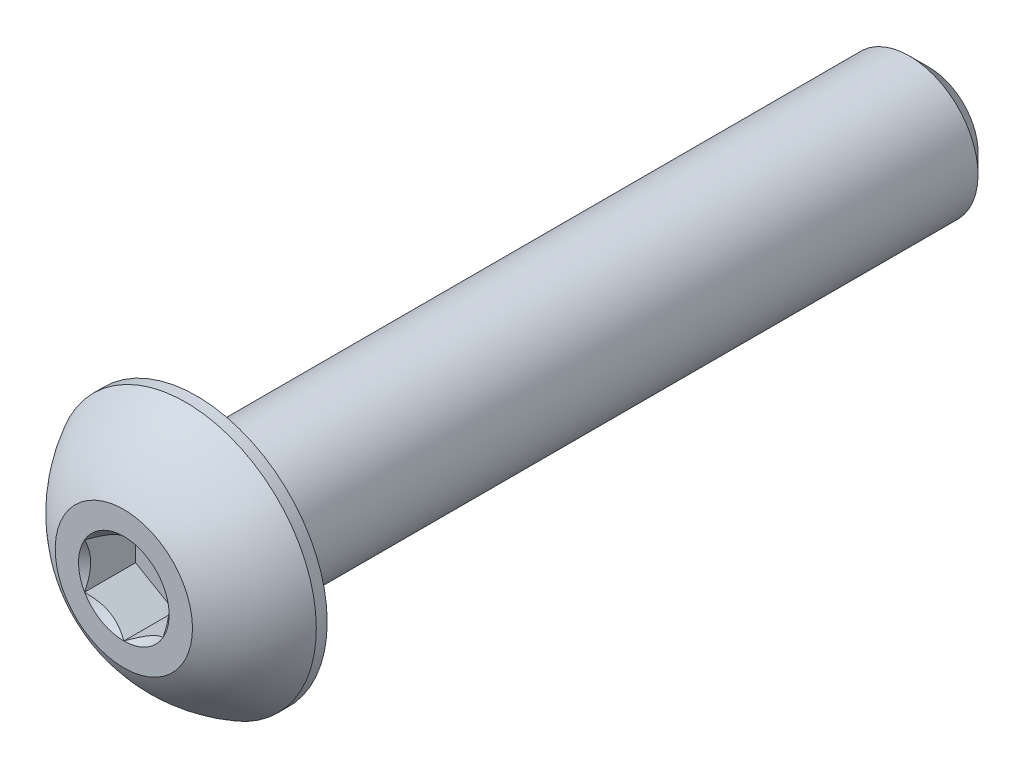
ISO-10303-21;
HEADER;
FILE_DESCRIPTION(('STEP AP214'),'2;1');
FILE_NAME('part.step','',(''),(''),'','','');
FILE_SCHEMA(('AUTOMOTIVE_DESIGN { 1 0 10303 214 1 1 1 1 }'));
ENDSEC;
DATA;
#1=APPLICATION_CONTEXT('core data for automotive mechanical design processes');
#2=APPLICATION_PROTOCOL_DEFINITION('international standard','automotive_design',2000,#1);
#3=PRODUCT_CONTEXT('',#1,'mechanical');
#4=PRODUCT('Part','Part','',(#3));
#5=PRODUCT_RELATED_PRODUCT_CATEGORY('part','',(#4));
#6=PRODUCT_DEFINITION_FORMATION('','',#4);
#7=PRODUCT_DEFINITION_CONTEXT('part definition',#1,'design');
#8=PRODUCT_DEFINITION('design','',#6,#7);
#9=PRODUCT_DEFINITION_SHAPE('','',#8);
#10=(LENGTH_UNIT() NAMED_UNIT(*) SI_UNIT(.MILLI.,.METRE.));
#11=(NAMED_UNIT(*) PLANE_ANGLE_UNIT() SI_UNIT($,.RADIAN.));
#12=(NAMED_UNIT(*) SI_UNIT($,.STERADIAN.) SOLID_ANGLE_UNIT());
#13=UNCERTAINTY_MEASURE_WITH_UNIT(LENGTH_MEASURE(1.E-05),#10,'distance_accuracy_value','');
#14=(GEOMETRIC_REPRESENTATION_CONTEXT(3) GLOBAL_UNCERTAINTY_ASSIGNED_CONTEXT((#13)) GLOBAL_UNIT_ASSIGNED_CONTEXT((#10,
#11,#12)) REPRESENTATION_CONTEXT('',''));
#15=CARTESIAN_POINT('',(0.,0.,0.));
#16=DIRECTION('',(0.,0.,1.));
#17=DIRECTION('',(1.,0.,0.));
#18=AXIS2_PLACEMENT_3D('',#15,#16,#17);
#19=CARTESIAN_POINT('',(0.,-2.0828,-24.4348));
#20=DIRECTION('',(0.,0.,-1.));
#21=DIRECTION('',(0.,1.,0.));
#22=AXIS2_PLACEMENT_3D('',#19,#20,#21);
#23=PLANE('',#22);
#24=CARTESIAN_POINT('',(0.,0.,-24.4348));
#25=DIRECTION('',(0.,0.,-1.));
#26=DIRECTION('',(0.,1.,0.));
#27=AXIS2_PLACEMENT_3D('',#24,#25,#26);
#28=CIRCLE('',#27,1.48748750000001);
#29=CARTESIAN_POINT('',(0.,1.48748750000001,-24.4348));
#30=VERTEX_POINT('',#29);
#31=EDGE_CURVE('E193',#30,#30,#28,.T.);
#32=ORIENTED_EDGE('',*,*,#31,.T.);
#33=EDGE_LOOP('',(#32));
#34=FACE_BOUND('',#33,.T.);
#35=ADVANCED_FACE('F36',(#34),#23,.T.);
#36=CARTESIAN_POINT('',(0.,0.,-24.4348));
#37=DIRECTION('',(0.,0.,-1.));
#38=DIRECTION('',(0.,1.,0.));
#39=AXIS2_PLACEMENT_3D('',#36,#37,#38);
#40=CYLINDRICAL_SURFACE('',#39,2.0828);
#41=CARTESIAN_POINT('',(0.,0.,-23.8394875));
#42=DIRECTION('',(0.,0.,-1.));
#43=DIRECTION('',(0.,1.,0.));
#44=AXIS2_PLACEMENT_3D('',#41,#42,#43);
#45=CIRCLE('',#44,2.0828);
#46=CARTESIAN_POINT('',(0.,2.0828,-23.8394875));
#47=VERTEX_POINT('',#46);
#48=EDGE_CURVE('E50',#47,#47,#45,.F.);
#49=ORIENTED_EDGE('',*,*,#48,.T.);
#50=EDGE_LOOP('',(#49));
#51=FACE_BOUND('',#50,.T.);
#52=CARTESIAN_POINT('',(0.,0.,-2.2098));
#53=DIRECTION('',(0.,0.,1.));
#54=DIRECTION('',(1.,0.,0.));
#55=AXIS2_PLACEMENT_3D('',#52,#53,#54);
#56=CIRCLE('',#55,2.0828);
#57=CARTESIAN_POINT('',(2.0828,0.,-2.2098));
#58=VERTEX_POINT('',#57);
#59=EDGE_CURVE('E189',#58,#58,#56,.F.);
#60=ORIENTED_EDGE('',*,*,#59,.T.);
#61=EDGE_LOOP('',(#60));
#62=FACE_BOUND('',#61,.T.);
#63=ADVANCED_FACE('F202',(#51,#62),#40,.T.);
#64=CARTESIAN_POINT('',(0.,0.,-24.4348));
#65=DIRECTION('',(0.,0.,1.));
#66=DIRECTION('',(0.,-1.,0.));
#67=AXIS2_PLACEMENT_3D('',#64,#65,#66);
#68=CONICAL_SURFACE('',#67,1.48748750000001,0.785398163397445);
#69=ORIENTED_EDGE('',*,*,#48,.F.);
#70=EDGE_LOOP('',(#69));
#71=FACE_BOUND('',#70,.T.);
#72=ORIENTED_EDGE('',*,*,#31,.F.);
#73=EDGE_LOOP('',(#72));
#74=FACE_BOUND('',#73,.T.);
#75=ADVANCED_FACE('F38',(#71,#74),#68,.T.);
#76=CARTESIAN_POINT('',(0.,0.,-3.96380867816092));
#77=DIRECTION('',(0.,0.,1.));
#78=DIRECTION('',(0.,-1.,0.));
#79=AXIS2_PLACEMENT_3D('',#76,#77,#78);
#80=SPHERICAL_SURFACE('',#79,4.47770421947049);
#81=CARTESIAN_POINT('',(0.,0.,0.));
#82=DIRECTION('',(0.,0.,1.));
#83=DIRECTION('',(1.,0.,0.));
#84=AXIS2_PLACEMENT_3D('',#81,#82,#83);
#85=CIRCLE('',#84,2.0828);
#86=CARTESIAN_POINT('',(0.,-2.0828,0.));
#87=VERTEX_POINT('',#86);
#88=EDGE_CURVE('E185',#87,#87,#85,.T.);
#89=CARTESIAN_POINT('',(0.,0.,-1.87833));
#90=DIRECTION('',(0.,0.,1.));
#91=DIRECTION('',(1.,0.,0.));
#92=AXIS2_PLACEMENT_3D('',#89,#90,#91);
#93=CIRCLE('',#92,3.9624);
#94=CARTESIAN_POINT('',(0.,-3.9624,-1.87833));
#95=VERTEX_POINT('',#94);
#96=EDGE_CURVE('E177',#95,#95,#93,.T.);
#97=CARTESIAN_POINT('',(0.,-2.0828,0.));
#98=CARTESIAN_POINT('',(0.,-2.10767763915469,-0.0130720224519119));
#99=CARTESIAN_POINT('',(0.,-2.1324321825138,-0.0263783080421214));
#100=CARTESIAN_POINT('',(0.,-2.18168637330346,-0.0534545587178047));
#101=CARTESIAN_POINT('',(0.,-2.20618602073402,-0.0672245238032784));
#102=CARTESIAN_POINT('',(0.,-2.25492171532923,-0.0952232866881574));
#103=CARTESIAN_POINT('',(0.,-2.27915776249387,-0.109452084487563));
#104=CARTESIAN_POINT('',(0.,-2.32735766987978,-0.138363459316015));
#105=CARTESIAN_POINT('',(0.,-2.35132153010105,-0.153046036345062));
#106=CARTESIAN_POINT('',(0.,-2.39896856692664,-0.18285976708332));
#107=CARTESIAN_POINT('',(0.,-2.42265174353097,-0.197990920792531));
#108=CARTESIAN_POINT('',(0.,-2.46972901769116,-0.22869644015681));
#109=CARTESIAN_POINT('',(0.,-2.49312311524703,-0.244270805811878));
#110=CARTESIAN_POINT('',(0.,-2.53961393789287,-0.275857228060145));
#111=CARTESIAN_POINT('',(0.,-2.56271066298286,-0.291869284653343));
#112=CARTESIAN_POINT('',(0.,-2.60859855282429,-0.324325412379582));
#113=CARTESIAN_POINT('',(0.,-2.63138971757574,-0.340769483512622));
#114=CARTESIAN_POINT('',(0.,-2.67665840715661,-0.37408381082988));
#115=CARTESIAN_POINT('',(0.,-2.69913593198603,-0.390954067014097));
#116=CARTESIAN_POINT('',(0.,-2.74376937333514,-0.425114783844112));
#117=CARTESIAN_POINT('',(0.,-2.76592528985483,-0.442405244489911));
#118=CARTESIAN_POINT('',(0.,-2.80990766020607,-0.477400240693377));
#119=CARTESIAN_POINT('',(0.,-2.83173411403762,-0.495104776251046));
#120=CARTESIAN_POINT('',(0.,-2.8750498214309,-0.530921645935845));
#121=CARTESIAN_POINT('',(0.,-2.89653907499262,-0.549033980062975));
#122=CARTESIAN_POINT('',(0.,-2.9391727638035,-0.585660025978066));
#123=CARTESIAN_POINT('',(0.,-2.96031719905264,-0.604173737766027));
#124=CARTESIAN_POINT('',(0.,-3.00225375543539,-0.641595975803774));
#125=CARTESIAN_POINT('',(0.,-3.02304587656899,-0.66050450205356));
#126=CARTESIAN_POINT('',(0.,-3.06427043381468,-0.698709665852366));
#127=CARTESIAN_POINT('',(0.,-3.08470286992677,-0.718006303401387));
#128=CARTESIAN_POINT('',(0.,-3.12520081373356,-0.756980849048762));
#129=CARTESIAN_POINT('',(0.,-3.14526632142825,-0.776658757147117));
#130=CARTESIAN_POINT('',(0.,-3.1850232950822,-0.816388867981037));
#131=CARTESIAN_POINT('',(0.,-3.20471476104147,-0.836441070716602));
#132=CARTESIAN_POINT('',(0.,-3.24371667050612,-0.876912662223586));
#133=CARTESIAN_POINT('',(0.,-3.2630271140115,-0.897332050995005));
#134=CARTESIAN_POINT('',(0.,-3.30126013292422,-0.938530775803146));
#135=CARTESIAN_POINT('',(0.,-3.32018270833155,-0.959310111839867));
#136=CARTESIAN_POINT('',(0.,-3.35763328290506,-1.00122136480503));
#137=CARTESIAN_POINT('',(0.,-3.37616128207125,-1.02235328173348));
#138=CARTESIAN_POINT('',(0.,-3.41281613589854,-1.06496220511693));
#139=CARTESIAN_POINT('',(0.,-3.43094299055964,-1.08643921157194));
#140=CARTESIAN_POINT('',(0.,-3.46678912932052,-1.12973070030741));
#141=CARTESIAN_POINT('',(0.,-3.48450841342031,-1.15154518258787));
#142=CARTESIAN_POINT('',(0.,-3.51953312948771,-1.19550388963655));
#143=CARTESIAN_POINT('',(0.,-3.53683856145534,-1.21764811440477));
#144=CARTESIAN_POINT('',(0.,-3.57102943840132,-1.26225845619532));
#145=CARTESIAN_POINT('',(0.,-3.58791488337967,-1.28472457321766));
#146=CARTESIAN_POINT('',(0.,-3.62125980037302,-1.32997073517287));
#147=CARTESIAN_POINT('',(0.,-3.637719272388,-1.35275078010575));
#148=CARTESIAN_POINT('',(0.,-3.67020640850626,-1.39861672224058));
#149=CARTESIAN_POINT('',(0.,-3.68623407260953,-1.42170261944253));
#150=CARTESIAN_POINT('',(0.,-3.71785191097313,-1.46817208208141));
#151=CARTESIAN_POINT('',(0.,-3.73344208523347,-1.49155564751835));
#152=CARTESIAN_POINT('',(0.,-3.76417941729919,-1.53861215694335));
#153=CARTESIAN_POINT('',(0.,-3.77932657510458,-1.56228510093141));
#154=CARTESIAN_POINT('',(0.,-3.80917250385283,-1.60991197565512));
#155=CARTESIAN_POINT('',(0.,-3.82387127479568,-1.63386590639077));
#156=CARTESIAN_POINT('',(0.,-3.85281522152763,-1.68204626145442));
#157=CARTESIAN_POINT('',(0.,-3.86706039731673,-1.70627268578243));
#158=CARTESIAN_POINT('',(0.,-3.89509209445425,-1.754989444771));
#159=CARTESIAN_POINT('',(0.,-3.90887861580268,-1.77947977943156));
#160=CARTESIAN_POINT('',(0.,-3.93598815139536,-1.8287156580258));
#161=CARTESIAN_POINT('',(0.,-3.94931116563961,-1.85346120195948));
#162=CARTESIAN_POINT('',(0.,-3.9624,-1.87833));
#163=B_SPLINE_CURVE_WITH_KNOTS('',3,(#97,#98,#99,#100,#101,#102,#103,#104,#105,#106,#107,#108,
#109,#110,#111,#112,#113,#114,#115,#116,#117,#118,#119,#120,#121,#122,#123,#124,#125,#126,#127,
#128,#129,#130,#131,#132,#133,#134,#135,#136,#137,#138,#139,#140,#141,#142,#143,#144,#145,#146,
#147,#148,#149,#150,#151,#152,#153,#154,#155,#156,#157,#158,#159,#160,#161,#162),.UNSPECIFIED.,
.F.,.F.,(4,2,2,2,2,2,2,2,2,2,2,2,2,2,2,2,2,2,2,2,2,2,2,2,2,2,2,2,2,2,2,2,4),(0.,
0.0843075442014962,0.168615088402992,0.252922632604488,0.337230176805985,0.421537721007481,
0.505845265208977,0.590152809410473,0.674460353611968,0.758767897813465,0.843075442014961,
0.927382986216457,1.01169053041795,1.09599807461945,1.18030561882095,1.26461316302244,
1.34892070722394,1.43322825142543,1.51753579562693,1.60184333982843,1.68615088402992,
1.77045842823142,1.85476597243292,1.93907351663441,2.02338106083591,2.1076886050374,
2.1919961492389,2.2763036934404,2.36061123764189,2.44491878184339,2.52922632604488,
2.61353387024638,2.69784141444788),.UNSPECIFIED.);
#164=EDGE_CURVE('BSEAM207',#87,#95,#163,.T.);
#165=ORIENTED_EDGE('',*,*,#88,.F.);
#166=ORIENTED_EDGE('',*,*,#96,.T.);
#167=ORIENTED_EDGE('',*,*,#164,.T.);
#168=ORIENTED_EDGE('',*,*,#164,.F.);
#169=EDGE_LOOP('',(#165,#167,#166,#168));
#170=FACE_BOUND('',#169,.T.);
#171=ADVANCED_FACE('F207',(#170),#80,.T.);
#172=CARTESIAN_POINT('',(0.,-2.0828,0.));
#173=DIRECTION('',(0.,0.,-1.));
#174=DIRECTION('',(-1.,0.,0.));
#175=AXIS2_PLACEMENT_3D('',#172,#173,#174);
#176=PLANE('',#175);
#177=CARTESIAN_POINT('',(0.,0.,0.));
#178=DIRECTION('',(0.,0.,1.));
#179=DIRECTION('',(1.,0.,0.));
#180=AXIS2_PLACEMENT_3D('',#177,#178,#179);
#181=CIRCLE('',#180,1.3748153285078);
#182=CARTESIAN_POINT('',(-1.190625,0.687407664253898,0.));
#183=VERTEX_POINT('',#182);
#184=CARTESIAN_POINT('',(-1.190625,-0.687407664253898,0.));
#185=VERTEX_POINT('',#184);
#186=EDGE_CURVE('E63',#183,#185,#181,.T.);
#187=ORIENTED_EDGE('',*,*,#186,.F.);
#188=CARTESIAN_POINT('',(0.,1.3748153285078,0.));
#189=VERTEX_POINT('',#188);
#190=EDGE_CURVE('E141',#189,#183,#181,.T.);
#191=ORIENTED_EDGE('',*,*,#190,.F.);
#192=CARTESIAN_POINT('',(1.190625,0.687407664253897,0.));
#193=VERTEX_POINT('',#192);
#194=EDGE_CURVE('E135',#193,#189,#181,.T.);
#195=ORIENTED_EDGE('',*,*,#194,.F.);
#196=CARTESIAN_POINT('',(1.190625,-0.687407664253897,0.));
#197=VERTEX_POINT('',#196);
#198=EDGE_CURVE('E104',#197,#193,#181,.T.);
#199=ORIENTED_EDGE('',*,*,#198,.F.);
#200=CARTESIAN_POINT('',(0.,-1.3748153285078,0.));
#201=VERTEX_POINT('',#200);
#202=EDGE_CURVE('E95',#201,#197,#181,.T.);
#203=ORIENTED_EDGE('',*,*,#202,.F.);
#204=EDGE_CURVE('E56',#185,#201,#181,.T.);
#205=ORIENTED_EDGE('',*,*,#204,.F.);
#206=EDGE_LOOP('',(#187,#191,#195,#199,#203,#205));
#207=FACE_BOUND('',#206,.T.);
#208=ORIENTED_EDGE('',*,*,#88,.T.);
#209=EDGE_LOOP('',(#208));
#210=FACE_BOUND('',#209,.T.);
#211=ADVANCED_FACE('F132',(#207,#210),#176,.F.);
#212=CARTESIAN_POINT('',(0.,-3.9624,-2.2098));
#213=DIRECTION('',(0.,0.,1.));
#214=DIRECTION('',(1.,0.,0.));
#215=AXIS2_PLACEMENT_3D('',#212,#213,#214);
#216=PLANE('',#215);
#217=ORIENTED_EDGE('',*,*,#59,.F.);
#218=EDGE_LOOP('',(#217));
#219=FACE_BOUND('',#218,.T.);
#220=CARTESIAN_POINT('',(0.,0.,-2.2098));
#221=DIRECTION('',(0.,0.,1.));
#222=DIRECTION('',(1.,0.,0.));
#223=AXIS2_PLACEMENT_3D('',#220,#221,#222);
#224=CIRCLE('',#223,3.9624);
#225=CARTESIAN_POINT('',(3.9624,0.,-2.2098));
#226=VERTEX_POINT('',#225);
#227=EDGE_CURVE('E181',#226,#226,#224,.T.);
#228=ORIENTED_EDGE('',*,*,#227,.F.);
#229=EDGE_LOOP('',(#228));
#230=FACE_BOUND('',#229,.T.);
#231=ADVANCED_FACE('F221',(#219,#230),#216,.F.);
#232=CARTESIAN_POINT('',(0.,0.,0.));
#233=DIRECTION('',(0.,0.,1.));
#234=DIRECTION('',(1.,0.,0.));
#235=AXIS2_PLACEMENT_3D('',#232,#233,#234);
#236=CYLINDRICAL_SURFACE('',#235,3.9624);
#237=ORIENTED_EDGE('',*,*,#96,.F.);
#238=EDGE_LOOP('',(#237));
#239=FACE_BOUND('',#238,.T.);
#240=ORIENTED_EDGE('',*,*,#227,.T.);
#241=EDGE_LOOP('',(#240));
#242=FACE_BOUND('',#241,.T.);
#243=ADVANCED_FACE('F224',(#239,#242),#236,.T.);
#244=CARTESIAN_POINT('',(0.,0.,0.));
#245=DIRECTION('',(0.,0.,1.));
#246=DIRECTION('',(1.,0.,0.));
#247=AXIS2_PLACEMENT_3D('',#244,#245,#246);
#248=CONICAL_SURFACE('',#247,1.3748153285078,0.78539816339745);
#249=ORIENTED_EDGE('',*,*,#198,.T.);
#250=CARTESIAN_POINT('',(1.190625,-1.3709714531464,0.440990447440542));
#251=CARTESIAN_POINT('',(1.190625,-1.33758920657277,0.415789988952627));
#252=CARTESIAN_POINT('',(1.190625,-1.30402095515484,0.39083662037646));
#253=CARTESIAN_POINT('',(1.190625,-1.23643692315458,0.341526087304664));
#254=CARTESIAN_POINT('',(1.190625,-1.20242103236242,0.317169074021072));
#255=CARTESIAN_POINT('',(1.190625,-1.09909081497949,0.244798209093533));
#256=CARTESIAN_POINT('',(1.190625,-1.02900143520981,0.19787262268834));
#257=CARTESIAN_POINT('',(1.190625,-0.882026737540628,0.105752103394674));
#258=CARTESIAN_POINT('',(1.190625,-0.804981866122373,0.0608088372989927));
#259=CARTESIAN_POINT('',(1.190625,-0.647043893381153,-0.0214019754586495));
#260=CARTESIAN_POINT('',(1.190625,-0.566164943760922,-0.0586953982437512));
#261=CARTESIAN_POINT('',(1.190625,-0.44476493391543,-0.104320444420462));
#262=CARTESIAN_POINT('',(1.190625,-0.406041211538073,-0.117415160961774));
#263=CARTESIAN_POINT('',(1.190625,-0.32765890477302,-0.140495724086987));
#264=CARTESIAN_POINT('',(1.190625,-0.288000256184281,-0.150481356498339));
#265=CARTESIAN_POINT('',(1.190625,-0.208647693287847,-0.166658770921501));
#266=CARTESIAN_POINT('',(1.190625,-0.168967240702489,-0.172915554139536));
#267=CARTESIAN_POINT('',(1.190625,-0.0891819743864537,-0.181513111574599));
#268=CARTESIAN_POINT('',(1.190625,-0.0490772347958497,-0.183854558946056));
#269=CARTESIAN_POINT('',(1.190625,0.0297075772901237,-0.184447755934784));
#270=CARTESIAN_POINT('',(1.190625,0.0683866067218453,-0.182844646209978));
#271=CARTESIAN_POINT('',(1.190625,0.145416876518752,-0.175956972269255));
#272=CARTESIAN_POINT('',(1.190625,0.183768052622756,-0.170671702349432));
#273=CARTESIAN_POINT('',(1.190625,0.260508634780065,-0.156618587793746));
#274=CARTESIAN_POINT('',(1.190625,0.298887051910834,-0.147791637425378));
#275=CARTESIAN_POINT('',(1.190625,0.374805334115854,-0.127124290059814));
#276=CARTESIAN_POINT('',(1.190625,0.412345269069195,-0.115284145209173));
#277=CARTESIAN_POINT('',(1.190625,0.530535580740913,-0.0735526663999539));
#278=CARTESIAN_POINT('',(1.190625,0.609503725551088,-0.0389086031730741));
#279=CARTESIAN_POINT('',(1.190625,0.763730268871195,0.0381182518446595));
#280=CARTESIAN_POINT('',(1.190625,0.838974064408866,0.0805288465159381));
#281=CARTESIAN_POINT('',(1.190625,0.982775795881686,0.16802564482912));
#282=CARTESIAN_POINT('',(1.190625,1.05148016574364,0.212874161838997));
#283=CARTESIAN_POINT('',(1.190625,1.15270222220782,0.282205329675897));
#284=CARTESIAN_POINT('',(1.190625,1.18600604109445,0.305560176080384));
#285=CARTESIAN_POINT('',(1.190625,1.25215860324015,0.352887568742374));
#286=CARTESIAN_POINT('',(1.190625,1.28500746829151,0.376859944571279));
#287=CARTESIAN_POINT('',(1.190625,1.31766689387937,0.401088366474198));
#288=B_SPLINE_CURVE_WITH_KNOTS('',3,(#250,#251,#252,#253,#254,#255,#256,#257,#258,#259,#260,
#261,#262,#263,#264,#265,#266,#267,#268,#269,#270,#271,#272,#273,#274,#275,#276,#277,#278,#279,
#280,#281,#282,#283,#284,#285,#286,#287),.UNSPECIFIED.,.F.,.F.,(4,2,2,2,2,2,2,2,2,2,2,2,2,2,2,2,
2,2,4),(0.,0.125475644787212,0.25098278246174,0.503912518865618,0.77127918479425,
1.03772598276166,1.16025581663754,1.28279408924409,1.40312855519665,1.52344233020123,
1.63939577678758,1.75537145253144,1.87336894106198,1.99135655871206,2.24929724984113,
2.50818004702776,2.75419821455323,2.87622362097735,2.99821570364111),.UNSPECIFIED.);
#289=EDGE_CURVE('E11',#197,#193,#288,.T.);
#290=ORIENTED_EDGE('',*,*,#289,.F.);
#291=EDGE_LOOP('',(#249,#290));
#292=FACE_BOUND('',#291,.T.);
#293=ADVANCED_FACE('F108',(#292),#248,.F.);
#294=ORIENTED_EDGE('',*,*,#194,.T.);
#295=CARTESIAN_POINT('',(1.190825,0.68729219420006,0.000115484600024774));
#296=CARTESIAN_POINT('',(1.14989058041014,0.710925692369385,-0.0235012357857359));
#297=CARTESIAN_POINT('',(1.10827161169803,0.734954415158721,-0.0457312182768786));
#298=CARTESIAN_POINT('',(1.02340555632637,0.783951855072609,-0.0864343373725623));
#299=CARTESIAN_POINT('',(0.980150392709039,0.808925235430915,-0.104884817352448));
#300=CARTESIAN_POINT('',(0.892928352542576,0.859282903800291,-0.136491161995679));
#301=CARTESIAN_POINT('',(0.848983705042075,0.884654357864148,-0.149726495756683));
#302=CARTESIAN_POINT('',(0.760126625836306,0.935956016463003,-0.170118548424605));
#303=CARTESIAN_POINT('',(0.715216911165245,0.961884652317569,-0.177290497104007));
#304=CARTESIAN_POINT('',(0.637820872343021,1.00656927616579,-0.183761461351143));
#305=CARTESIAN_POINT('',(0.605434587484353,1.02526750644699,-0.18471967985321));
#306=CARTESIAN_POINT('',(0.54071892668223,1.06263111063189,-0.183107350927916));
#307=CARTESIAN_POINT('',(0.508389564872727,1.08129647637533,-0.18053602482042));
#308=CARTESIAN_POINT('',(0.444042843928515,1.11844707303394,-0.172013246006378));
#309=CARTESIAN_POINT('',(0.412025803663232,1.13693211984976,-0.166058645247436));
#310=CARTESIAN_POINT('',(0.348526236603542,1.17359361198509,-0.1510900359288));
#311=CARTESIAN_POINT('',(0.317043945355835,1.19176992131166,-0.142074714087945));
#312=CARTESIAN_POINT('',(0.236410161427873,1.23832385816825,-0.115317704161983));
#313=CARTESIAN_POINT('',(0.187767164732342,1.26640790540461,-0.0955631855639915));
#314=CARTESIAN_POINT('',(0.0923855836478806,1.32147648691945,-0.0510632310423196));
#315=CARTESIAN_POINT('',(0.045641382412844,1.34846426408555,-0.0263340352838409));
#316=CARTESIAN_POINT('',(-0.000200000000000448,1.37493079856163,0.000115484600024356));
#317=B_SPLINE_CURVE_WITH_KNOTS('',3,(#295,#296,#297,#298,#299,#300,#301,#302,#303,#304,#305,
#306,#307,#308,#309,#310,#311,#312,#313,#314,#315,#316),.UNSPECIFIED.,.F.,.F.,(4,2,2,2,2,2,2,2,
2,2,4),(0.,0.15862567293412,0.318176079843271,0.475191357500656,0.631811068630749,
0.743878551794718,0.855970763007029,0.968167444423242,1.08041232768377,1.25873351645467,
1.43648174479847),.UNSPECIFIED.);
#318=EDGE_CURVE('E140',#193,#189,#317,.T.);
#319=ORIENTED_EDGE('',*,*,#318,.F.);
#320=EDGE_LOOP('',(#294,#319));
#321=FACE_BOUND('',#320,.T.);
#322=ADVANCED_FACE('F309',(#321),#248,.F.);
#323=ORIENTED_EDGE('',*,*,#190,.T.);
#324=CARTESIAN_POINT('',(0.000199999999999361,1.37493079856163,0.000115484600024428));
#325=CARTESIAN_POINT('',(-0.040734419589857,1.35129730039231,-0.0235012357857362));
#326=CARTESIAN_POINT('',(-0.0823533883019744,1.32726857760297,-0.0457312182768788));
#327=CARTESIAN_POINT('',(-0.167219443673633,1.27827113768908,-0.0864343373725624));
#328=CARTESIAN_POINT('',(-0.210474607290961,1.25329775733078,-0.104884817352448));
#329=CARTESIAN_POINT('',(-0.297696647457425,1.2029400889614,-0.136491161995678));
#330=CARTESIAN_POINT('',(-0.341641294957926,1.17756863489755,-0.149726495756683));
#331=CARTESIAN_POINT('',(-0.430498374163694,1.12626697629869,-0.170118548424605));
#332=CARTESIAN_POINT('',(-0.475408088834755,1.10033834044412,-0.177290497104007));
#333=CARTESIAN_POINT('',(-0.552804127656978,1.0556537165959,-0.183761461351143));
#334=CARTESIAN_POINT('',(-0.585190412515647,1.0369554863147,-0.18471967985321));
#335=CARTESIAN_POINT('',(-0.64990607331777,0.999591882129809,-0.183107350927915));
#336=CARTESIAN_POINT('',(-0.682235435127273,0.980926516386364,-0.18053602482042));
#337=CARTESIAN_POINT('',(-0.746582156071485,0.943775919727753,-0.172013246006378));
#338=CARTESIAN_POINT('',(-0.778599196336768,0.925290872911937,-0.166058645247435));
#339=CARTESIAN_POINT('',(-0.842098763396457,0.8886293807766,-0.151090035928799));
#340=CARTESIAN_POINT('',(-0.873581054644164,0.870453071450031,-0.142074714087945));
#341=CARTESIAN_POINT('',(-0.954214838572127,0.823899134593443,-0.115317704161983));
#342=CARTESIAN_POINT('',(-1.00285783526766,0.795815087357089,-0.0955631855639908));
#343=CARTESIAN_POINT('',(-1.09823941635212,0.740746505842243,-0.051063231042319));
#344=CARTESIAN_POINT('',(-1.14498361758716,0.713758728676141,-0.0263340352838404));
#345=CARTESIAN_POINT('',(-1.190825,0.68729219420006,0.00011548460002478));
#346=B_SPLINE_CURVE_WITH_KNOTS('',3,(#324,#325,#326,#327,#328,#329,#330,#331,#332,#333,#334,
#335,#336,#337,#338,#339,#340,#341,#342,#343,#344,#345),.UNSPECIFIED.,.F.,.F.,(4,2,2,2,2,2,2,2,
2,2,4),(0.,0.15862567293412,0.318176079843271,0.475191357500655,0.631811068630748,
0.743878551794717,0.855970763007028,0.968167444423241,1.08041232768377,1.25873351645467,
1.43648174479847),.UNSPECIFIED.);
#347=EDGE_CURVE('E148',#189,#183,#346,.T.);
#348=ORIENTED_EDGE('',*,*,#347,.F.);
#349=EDGE_LOOP('',(#323,#348));
#350=FACE_BOUND('',#349,.T.);
#351=ADVANCED_FACE('F151',(#350),#248,.F.);
#352=ORIENTED_EDGE('',*,*,#186,.T.);
#353=CARTESIAN_POINT('',(-1.190625,-1.37097145294693,0.440990447289941));
#354=CARTESIAN_POINT('',(-1.190625,-1.3375892063789,0.415789988807826));
#355=CARTESIAN_POINT('',(-1.190625,-1.30402095496658,0.39083662023745));
#356=CARTESIAN_POINT('',(-1.190625,-1.23643692297761,0.341526087177203));
#357=CARTESIAN_POINT('',(-1.190625,-1.20242103219112,0.317169073899369));
#358=CARTESIAN_POINT('',(-1.190625,-1.09909081482554,0.244798208989214));
#359=CARTESIAN_POINT('',(-1.190625,-1.02900143506767,0.197872622595561));
#360=CARTESIAN_POINT('',(-1.190625,-0.882026737424228,0.105752103325632));
#361=CARTESIAN_POINT('',(-1.190625,-0.804981866019979,0.0608088372420607));
#362=CARTESIAN_POINT('',(-1.190625,-0.647043893307963,-0.0214019754931313));
#363=CARTESIAN_POINT('',(-1.190625,-0.566164943702919,-0.0586953982678776));
#364=CARTESIAN_POINT('',(-1.190625,-0.444764933868855,-0.104320444436902));
#365=CARTESIAN_POINT('',(-1.190625,-0.406041211486712,-0.117415160978515));
#366=CARTESIAN_POINT('',(-1.190625,-0.327658904711932,-0.140495724103358));
#367=CARTESIAN_POINT('',(-1.190625,-0.288000256118251,-0.150481356514042));
#368=CARTESIAN_POINT('',(-1.190625,-0.208647693212096,-0.166658770934747));
#369=CARTESIAN_POINT('',(-1.190625,-0.168967240621961,-0.172915554151021));
#370=CARTESIAN_POINT('',(-1.190625,-0.0891819742965327,-0.181513111581485));
#371=CARTESIAN_POINT('',(-1.190625,-0.0490772347013119,-0.183854558950102));
#372=CARTESIAN_POINT('',(-1.190625,0.0297075773931768,-0.184447755932346));
#373=CARTESIAN_POINT('',(-1.190625,0.0683866068288089,-0.18284464620395));
#374=CARTESIAN_POINT('',(-1.190625,0.14541687663315,-0.175956972255488));
#375=CARTESIAN_POINT('',(-1.190625,0.183768052740679,-0.170671702331515));
#376=CARTESIAN_POINT('',(-1.190625,0.260508634904944,-0.156618587767132));
#377=CARTESIAN_POINT('',(-1.190625,0.298887052039132,-0.14779163739419));
#378=CARTESIAN_POINT('',(-1.190625,0.374805334250663,-0.127124290019377));
#379=CARTESIAN_POINT('',(-1.190625,0.412345269207094,-0.115284145164061));
#380=CARTESIAN_POINT('',(-1.190625,0.530535580908839,-0.0735526663328063));
#381=CARTESIAN_POINT('',(-1.190625,0.609503725744446,-0.0389086030856521));
#382=CARTESIAN_POINT('',(-1.190625,0.763730269113465,0.038118251974864));
#383=CARTESIAN_POINT('',(-1.190625,0.838974064674605,0.0805288466686665));
#384=CARTESIAN_POINT('',(-1.190625,0.982775796189617,0.16802564502496));
#385=CARTESIAN_POINT('',(-1.190625,1.05148016607044,0.212874162055227));
#386=CARTESIAN_POINT('',(-1.190625,1.15270222256253,0.282205329922607));
#387=CARTESIAN_POINT('',(-1.190625,1.18600604145834,0.305560176337174));
#388=CARTESIAN_POINT('',(-1.190625,1.25215860362231,0.35288756901931));
#389=CARTESIAN_POINT('',(-1.190625,1.28500746868279,0.376859944858283));
#390=CARTESIAN_POINT('',(-1.190625,1.31766689427973,0.401088366771256));
#391=B_SPLINE_CURVE_WITH_KNOTS('',3,(#353,#354,#355,#356,#357,#358,#359,#360,#361,#362,#363,
#364,#365,#366,#367,#368,#369,#370,#371,#372,#373,#374,#375,#376,#377,#378,#379,#380,#381,#382,
#383,#384,#385,#386,#387,#388,#389,#390),.UNSPECIFIED.,.F.,.F.,(4,2,2,2,2,2,2,2,2,2,2,2,2,2,2,2,
2,2,4),(0.,0.12547564476333,0.250982782413967,0.503912518769174,0.771279184643224,
1.03772598255657,1.16025581644629,1.28279408906665,1.40312855503246,1.5234423300503,
1.63939577664876,1.75537145240477,1.87336894094838,1.99135655861152,2.24929724983449,
2.50818004711563,2.75419821472196,2.87622362118596,2.99821570388961),.UNSPECIFIED.);
#392=EDGE_CURVE('E155',#183,#185,#391,.F.);
#393=ORIENTED_EDGE('',*,*,#392,.F.);
#394=EDGE_LOOP('',(#352,#393));
#395=FACE_BOUND('',#394,.T.);
#396=ADVANCED_FACE('F303',(#395),#248,.F.);
#397=ORIENTED_EDGE('',*,*,#204,.T.);
#398=CARTESIAN_POINT('',(-1.190825,-0.68729219420006,0.00011548460002434));
#399=CARTESIAN_POINT('',(-1.14989058041014,-0.710925692369385,-0.0235012357857362));
#400=CARTESIAN_POINT('',(-1.10827161169803,-0.734954415158721,-0.0457312182768788));
#401=CARTESIAN_POINT('',(-1.02340555632637,-0.783951855072609,-0.0864343373725625));
#402=CARTESIAN_POINT('',(-0.980150392709039,-0.808925235430915,-0.104884817352448));
#403=CARTESIAN_POINT('',(-0.892928352542576,-0.859282903800291,-0.136491161995679));
#404=CARTESIAN_POINT('',(-0.848983705042075,-0.884654357864148,-0.149726495756683));
#405=CARTESIAN_POINT('',(-0.760126625836306,-0.935956016463003,-0.170118548424605));
#406=CARTESIAN_POINT('',(-0.715216911165245,-0.961884652317569,-0.177290497104007));
#407=CARTESIAN_POINT('',(-0.637820872343022,-1.00656927616579,-0.183761461351143));
#408=CARTESIAN_POINT('',(-0.605434587484353,-1.02526750644699,-0.18471967985321));
#409=CARTESIAN_POINT('',(-0.54071892668223,-1.06263111063189,-0.183107350927916));
#410=CARTESIAN_POINT('',(-0.508389564872727,-1.08129647637533,-0.18053602482042));
#411=CARTESIAN_POINT('',(-0.444042843928515,-1.11844707303394,-0.172013246006378));
#412=CARTESIAN_POINT('',(-0.412025803663232,-1.13693211984976,-0.166058645247435));
#413=CARTESIAN_POINT('',(-0.348526236603543,-1.17359361198509,-0.151090035928799));
#414=CARTESIAN_POINT('',(-0.317043945355836,-1.19176992131166,-0.142074714087945));
#415=CARTESIAN_POINT('',(-0.236410161427873,-1.23832385816825,-0.115317704161983));
#416=CARTESIAN_POINT('',(-0.187767164732342,-1.26640790540461,-0.0955631855639914));
#417=CARTESIAN_POINT('',(-0.0923855836478815,-1.32147648691945,-0.0510632310423198));
#418=CARTESIAN_POINT('',(-0.0456413824128449,-1.34846426408555,-0.0263340352838412));
#419=CARTESIAN_POINT('',(0.000199999999999495,-1.37493079856163,0.000115484600024144));
#420=B_SPLINE_CURVE_WITH_KNOTS('',3,(#398,#399,#400,#401,#402,#403,#404,#405,#406,#407,#408,
#409,#410,#411,#412,#413,#414,#415,#416,#417,#418,#419),.UNSPECIFIED.,.F.,.F.,(4,2,2,2,2,2,2,2,
2,2,4),(0.,0.15862567293412,0.318176079843271,0.475191357500655,0.631811068630748,
0.743878551794718,0.855970763007029,0.968167444423241,1.08041232768376,1.25873351645467,
1.43648174479847),.UNSPECIFIED.);
#421=EDGE_CURVE('E121',#185,#201,#420,.T.);
#422=ORIENTED_EDGE('',*,*,#421,.F.);
#423=EDGE_LOOP('',(#397,#422));
#424=FACE_BOUND('',#423,.T.);
#425=ADVANCED_FACE('F249',(#424),#248,.F.);
#426=ORIENTED_EDGE('',*,*,#202,.T.);
#427=CARTESIAN_POINT('',(-0.000200000000000427,-1.37493079856163,0.000115484600024211));
#428=CARTESIAN_POINT('',(0.040734419589856,-1.35129730039231,-0.0235012357857364));
#429=CARTESIAN_POINT('',(0.0823533883019735,-1.32726857760297,-0.0457312182768791));
#430=CARTESIAN_POINT('',(0.167219443673632,-1.27827113768908,-0.0864343373725629));
#431=CARTESIAN_POINT('',(0.21047460729096,-1.25329775733078,-0.104884817352449));
#432=CARTESIAN_POINT('',(0.297696647457424,-1.2029400889614,-0.136491161995679));
#433=CARTESIAN_POINT('',(0.341641294957925,-1.17756863489755,-0.149726495756684));
#434=CARTESIAN_POINT('',(0.430498374163693,-1.12626697629869,-0.170118548424605));
#435=CARTESIAN_POINT('',(0.475408088834755,-1.10033834044412,-0.177290497104008));
#436=CARTESIAN_POINT('',(0.552804127656978,-1.0556537165959,-0.183761461351144));
#437=CARTESIAN_POINT('',(0.585190412515646,-1.0369554863147,-0.184719679853211));
#438=CARTESIAN_POINT('',(0.649906073317769,-0.999591882129809,-0.183107350927916));
#439=CARTESIAN_POINT('',(0.682235435127272,-0.980926516386363,-0.180536024820421));
#440=CARTESIAN_POINT('',(0.746582156071484,-0.943775919727753,-0.172013246006379));
#441=CARTESIAN_POINT('',(0.778599196336767,-0.925290872911936,-0.166058645247436));
#442=CARTESIAN_POINT('',(0.842098763396456,-0.8886293807766,-0.1510900359288));
#443=CARTESIAN_POINT('',(0.873581054644163,-0.87045307145003,-0.142074714087946));
#444=CARTESIAN_POINT('',(0.954214838572126,-0.823899134593443,-0.115317704161984));
#445=CARTESIAN_POINT('',(1.00285783526766,-0.795815087357088,-0.095563185563992));
#446=CARTESIAN_POINT('',(1.09823941635212,-0.740746505842242,-0.0510632310423199));
#447=CARTESIAN_POINT('',(1.14498361758716,-0.713758728676139,-0.0263340352838411));
#448=CARTESIAN_POINT('',(1.190825,-0.687292194200059,0.000115484600024334));
#449=B_SPLINE_CURVE_WITH_KNOTS('',3,(#427,#428,#429,#430,#431,#432,#433,#434,#435,#436,#437,
#438,#439,#440,#441,#442,#443,#444,#445,#446,#447,#448),.UNSPECIFIED.,.F.,.F.,(4,2,2,2,2,2,2,2,
2,2,4),(0.,0.15862567293412,0.318176079843271,0.475191357500656,0.631811068630749,
0.743878551794718,0.855970763007029,0.968167444423242,1.08041232768377,1.25873351645467,
1.43648174479847),.UNSPECIFIED.);
#450=EDGE_CURVE('E99',#201,#197,#449,.T.);
#451=ORIENTED_EDGE('',*,*,#450,.F.);
#452=EDGE_LOOP('',(#426,#451));
#453=FACE_BOUND('',#452,.T.);
#454=ADVANCED_FACE('F97',(#453),#248,.F.);
#455=CARTESIAN_POINT('',(1.190625,-0.687407664253897,-1.54686));
#456=DIRECTION('',(0.,0.,1.));
#457=DIRECTION('',(1.,0.,0.));
#458=AXIS2_PLACEMENT_3D('',#455,#456,#457);
#459=PLANE('',#458);
#460=DIRECTION('',(0.866025403784438,0.5,0.));
#461=VECTOR('',#460,1.);
#462=CARTESIAN_POINT('',(0.,-1.3748153285078,-1.54686));
#463=LINE('',#462,#461);
#464=CARTESIAN_POINT('',(0.,-1.3748153285078,-1.54686));
#465=VERTEX_POINT('',#464);
#466=CARTESIAN_POINT('',(1.190625,-0.687407664253897,-1.54686));
#467=VERTEX_POINT('',#466);
#468=EDGE_CURVE('E120',#465,#467,#463,.T.);
#469=ORIENTED_EDGE('',*,*,#468,.T.);
#470=DIRECTION('',(0.,1.,0.));
#471=VECTOR('',#470,1.);
#472=CARTESIAN_POINT('',(1.190625,-0.687407664253897,-1.54686));
#473=LINE('',#472,#471);
#474=CARTESIAN_POINT('',(1.190625,0.687407664253898,-1.54686));
#475=VERTEX_POINT('',#474);
#476=EDGE_CURVE('E125',#467,#475,#473,.T.);
#477=ORIENTED_EDGE('',*,*,#476,.T.);
#478=DIRECTION('',(-0.866025403784439,0.5,0.));
#479=VECTOR('',#478,1.);
#480=CARTESIAN_POINT('',(1.190625,0.687407664253898,-1.54686));
#481=LINE('',#480,#479);
#482=CARTESIAN_POINT('',(0.,1.3748153285078,-1.54686));
#483=VERTEX_POINT('',#482);
#484=EDGE_CURVE('E290',#475,#483,#481,.T.);
#485=ORIENTED_EDGE('',*,*,#484,.T.);
#486=DIRECTION('',(-0.866025403784439,-0.5,0.));
#487=VECTOR('',#486,1.);
#488=CARTESIAN_POINT('',(0.,1.3748153285078,-1.54686));
#489=LINE('',#488,#487);
#490=CARTESIAN_POINT('',(-1.190625,0.687407664253898,-1.54686));
#491=VERTEX_POINT('',#490);
#492=EDGE_CURVE('E164',#483,#491,#489,.T.);
#493=ORIENTED_EDGE('',*,*,#492,.T.);
#494=DIRECTION('',(0.,-1.,0.));
#495=VECTOR('',#494,1.);
#496=CARTESIAN_POINT('',(-1.190625,0.687407664253898,-1.54686));
#497=LINE('',#496,#495);
#498=CARTESIAN_POINT('',(-1.190625,-0.687407664253898,-1.54686));
#499=VERTEX_POINT('',#498);
#500=EDGE_CURVE('E296',#491,#499,#497,.T.);
#501=ORIENTED_EDGE('',*,*,#500,.T.);
#502=DIRECTION('',(0.866025403784439,-0.5,0.));
#503=VECTOR('',#502,1.);
#504=CARTESIAN_POINT('',(-1.190625,-0.687407664253898,-1.54686));
#505=LINE('',#504,#503);
#506=EDGE_CURVE('E129',#499,#465,#505,.T.);
#507=ORIENTED_EDGE('',*,*,#506,.T.);
#508=EDGE_LOOP('',(#469,#477,#485,#493,#501,#507));
#509=FACE_BOUND('',#508,.T.);
#510=ADVANCED_FACE('F248',(#509),#459,.T.);
#511=CARTESIAN_POINT('',(1.190625,-0.687407664253897,-1.54686));
#512=DIRECTION('',(1.,0.,0.));
#513=DIRECTION('',(0.,1.,0.));
#514=AXIS2_PLACEMENT_3D('',#511,#512,#513);
#515=PLANE('',#514);
#516=DIRECTION('',(0.,0.,1.));
#517=VECTOR('',#516,1.);
#518=CARTESIAN_POINT('',(1.190625,-0.687407664253897,-1.54686));
#519=LINE('',#518,#517);
#520=EDGE_CURVE('E116',#467,#197,#519,.T.);
#521=ORIENTED_EDGE('',*,*,#520,.T.);
#522=ORIENTED_EDGE('',*,*,#289,.T.);
#523=DIRECTION('',(0.,0.,1.));
#524=VECTOR('',#523,1.);
#525=CARTESIAN_POINT('',(1.190625,0.687407664253898,-1.54686));
#526=LINE('',#525,#524);
#527=EDGE_CURVE('E128',#475,#193,#526,.T.);
#528=ORIENTED_EDGE('',*,*,#527,.F.);
#529=ORIENTED_EDGE('',*,*,#476,.F.);
#530=EDGE_LOOP('',(#521,#522,#528,#529));
#531=FACE_BOUND('',#530,.T.);
#532=ADVANCED_FACE('F123',(#531),#515,.F.);
#533=CARTESIAN_POINT('',(1.190625,0.687407664253898,-1.54686));
#534=DIRECTION('',(0.5,0.866025403784439,0.));
#535=DIRECTION('',(-0.866025403784439,0.5,0.));
#536=AXIS2_PLACEMENT_3D('',#533,#534,#535);
#537=PLANE('',#536);
#538=ORIENTED_EDGE('',*,*,#527,.T.);
#539=ORIENTED_EDGE('',*,*,#318,.T.);
#540=DIRECTION('',(0.,0.,1.));
#541=VECTOR('',#540,1.);
#542=CARTESIAN_POINT('',(0.,1.3748153285078,-1.54686));
#543=LINE('',#542,#541);
#544=EDGE_CURVE('E160',#483,#189,#543,.T.);
#545=ORIENTED_EDGE('',*,*,#544,.F.);
#546=ORIENTED_EDGE('',*,*,#484,.F.);
#547=EDGE_LOOP('',(#538,#539,#545,#546));
#548=FACE_BOUND('',#547,.T.);
#549=ADVANCED_FACE('F158',(#548),#537,.F.);
#550=CARTESIAN_POINT('',(0.,1.3748153285078,-1.54686));
#551=DIRECTION('',(-0.5,0.866025403784439,0.));
#552=DIRECTION('',(-0.866025403784439,-0.5,0.));
#553=AXIS2_PLACEMENT_3D('',#550,#551,#552);
#554=PLANE('',#553);
#555=ORIENTED_EDGE('',*,*,#544,.T.);
#556=ORIENTED_EDGE('',*,*,#347,.T.);
#557=DIRECTION('',(0.,0.,1.));
#558=VECTOR('',#557,1.);
#559=CARTESIAN_POINT('',(-1.190625,0.687407664253898,-1.54686));
#560=LINE('',#559,#558);
#561=EDGE_CURVE('E167',#491,#183,#560,.T.);
#562=ORIENTED_EDGE('',*,*,#561,.F.);
#563=ORIENTED_EDGE('',*,*,#492,.F.);
#564=EDGE_LOOP('',(#555,#556,#562,#563));
#565=FACE_BOUND('',#564,.T.);
#566=ADVANCED_FACE('F162',(#565),#554,.F.);
#567=CARTESIAN_POINT('',(-1.190625,0.687407664253898,-1.54686));
#568=DIRECTION('',(-1.,0.,0.));
#569=DIRECTION('',(0.,-1.,0.));
#570=AXIS2_PLACEMENT_3D('',#567,#568,#569);
#571=PLANE('',#570);
#572=ORIENTED_EDGE('',*,*,#561,.T.);
#573=ORIENTED_EDGE('',*,*,#392,.T.);
#574=DIRECTION('',(0.,0.,1.));
#575=VECTOR('',#574,1.);
#576=CARTESIAN_POINT('',(-1.190625,-0.687407664253898,-1.54686));
#577=LINE('',#576,#575);
#578=EDGE_CURVE('E171',#499,#185,#577,.T.);
#579=ORIENTED_EDGE('',*,*,#578,.F.);
#580=ORIENTED_EDGE('',*,*,#500,.F.);
#581=EDGE_LOOP('',(#572,#573,#579,#580));
#582=FACE_BOUND('',#581,.T.);
#583=ADVANCED_FACE('F267',(#582),#571,.F.);
#584=CARTESIAN_POINT('',(-1.190625,-0.687407664253898,-1.54686));
#585=DIRECTION('',(-0.5,-0.866025403784439,0.));
#586=DIRECTION('',(0.866025403784439,-0.5,0.));
#587=AXIS2_PLACEMENT_3D('',#584,#585,#586);
#588=PLANE('',#587);
#589=ORIENTED_EDGE('',*,*,#578,.T.);
#590=ORIENTED_EDGE('',*,*,#421,.T.);
#591=DIRECTION('',(0.,0.,1.));
#592=VECTOR('',#591,1.);
#593=CARTESIAN_POINT('',(0.,-1.3748153285078,-1.54686));
#594=LINE('',#593,#592);
#595=EDGE_CURVE('E118',#465,#201,#594,.T.);
#596=ORIENTED_EDGE('',*,*,#595,.F.);
#597=ORIENTED_EDGE('',*,*,#506,.F.);
#598=EDGE_LOOP('',(#589,#590,#596,#597));
#599=FACE_BOUND('',#598,.T.);
#600=ADVANCED_FACE('F231',(#599),#588,.F.);
#601=CARTESIAN_POINT('',(0.,-1.3748153285078,-1.54686));
#602=DIRECTION('',(0.5,-0.866025403784439,0.));
#603=DIRECTION('',(0.866025403784439,0.5,0.));
#604=AXIS2_PLACEMENT_3D('',#601,#602,#603);
#605=PLANE('',#604);
#606=ORIENTED_EDGE('',*,*,#595,.T.);
#607=ORIENTED_EDGE('',*,*,#450,.T.);
#608=ORIENTED_EDGE('',*,*,#520,.F.);
#609=ORIENTED_EDGE('',*,*,#468,.F.);
#610=EDGE_LOOP('',(#606,#607,#608,#609));
#611=FACE_BOUND('',#610,.T.);
#612=ADVANCED_FACE('F114',(#611),#605,.F.);
#613=CLOSED_SHELL('',(#35,#63,#75,#171,#211,#231,#243,#293,#322,#351,#396,#425,#454,#510,#532,
#549,#566,#583,#600,#612));
#614=MANIFOLD_SOLID_BREP('B2',#613);
#615=ADVANCED_BREP_SHAPE_REPRESENTATION('',(#18,#614),#14);
#616=SHAPE_DEFINITION_REPRESENTATION(#9,#615);
ENDSEC;
END-ISO-10303-21;
